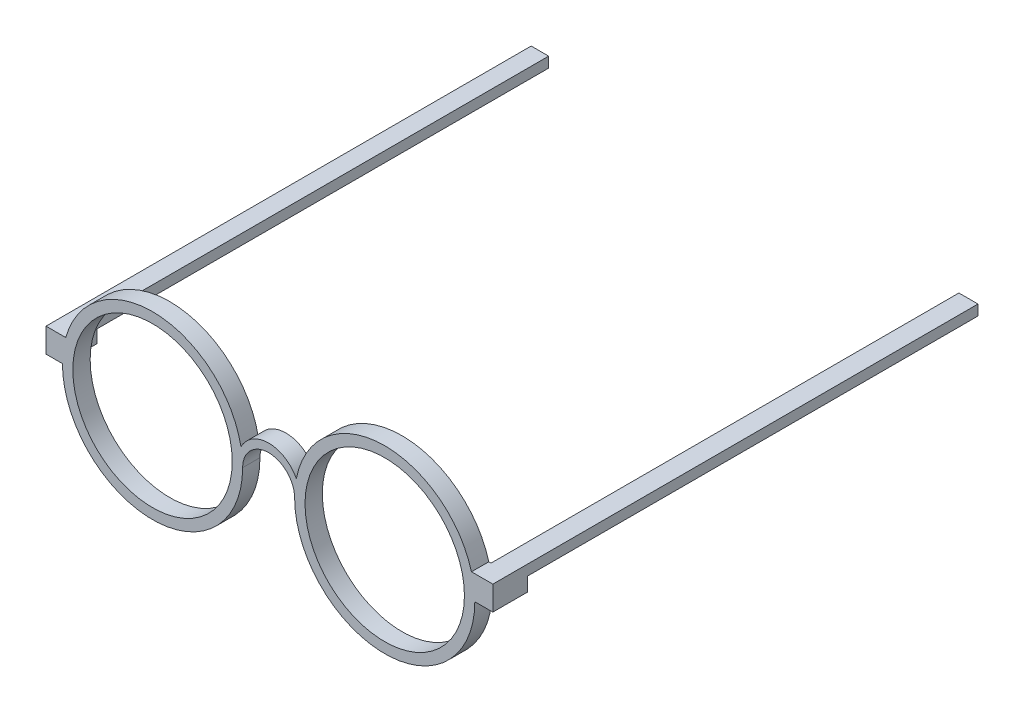
ISO-10303-21;
HEADER;
FILE_DESCRIPTION(('STEP AP214'),'2;1');
FILE_NAME('part.step','',(''),(''),'','','');
FILE_SCHEMA(('AUTOMOTIVE_DESIGN { 1 0 10303 214 1 1 1 1 }'));
ENDSEC;
DATA;
#1=APPLICATION_CONTEXT('core data for automotive mechanical design processes');
#2=APPLICATION_PROTOCOL_DEFINITION('international standard','automotive_design',2000,#1);
#3=PRODUCT_CONTEXT('',#1,'mechanical');
#4=PRODUCT('Part','Part','',(#3));
#5=PRODUCT_RELATED_PRODUCT_CATEGORY('part','',(#4));
#6=PRODUCT_DEFINITION_FORMATION('','',#4);
#7=PRODUCT_DEFINITION_CONTEXT('part definition',#1,'design');
#8=PRODUCT_DEFINITION('design','',#6,#7);
#9=PRODUCT_DEFINITION_SHAPE('','',#8);
#10=(LENGTH_UNIT() NAMED_UNIT(*) SI_UNIT(.MILLI.,.METRE.));
#11=(NAMED_UNIT(*) PLANE_ANGLE_UNIT() SI_UNIT($,.RADIAN.));
#12=(NAMED_UNIT(*) SI_UNIT($,.STERADIAN.) SOLID_ANGLE_UNIT());
#13=UNCERTAINTY_MEASURE_WITH_UNIT(LENGTH_MEASURE(1.E-05),#10,'distance_accuracy_value','');
#14=(GEOMETRIC_REPRESENTATION_CONTEXT(3) GLOBAL_UNCERTAINTY_ASSIGNED_CONTEXT((#13)) GLOBAL_UNIT_ASSIGNED_CONTEXT((#10,
#11,#12)) REPRESENTATION_CONTEXT('',''));
#15=CARTESIAN_POINT('',(0.,0.,0.));
#16=DIRECTION('',(0.,0.,1.));
#17=DIRECTION('',(1.,0.,0.));
#18=AXIS2_PLACEMENT_3D('',#15,#16,#17);
#19=CARTESIAN_POINT('',(-33.5,0.,5.));
#20=DIRECTION('',(0.,0.,-1.));
#21=DIRECTION('',(-1.,0.,0.));
#22=AXIS2_PLACEMENT_3D('',#19,#20,#21);
#23=CYLINDRICAL_SURFACE('',#22,26.);
#24=DIRECTION('',(0.,0.,-1.));
#25=VECTOR('',#24,1.);
#26=CARTESIAN_POINT('',(-58.5399680510978,6.99999999999998,5.));
#27=LINE('',#26,#25);
#28=CARTESIAN_POINT('',(-58.5399680510978,6.99999999999998,5.));
#29=VERTEX_POINT('',#28);
#30=CARTESIAN_POINT('',(-58.5399680510978,6.99999999999998,0.));
#31=VERTEX_POINT('',#30);
#32=EDGE_CURVE('E447',#29,#31,#27,.T.);
#33=ORIENTED_EDGE('',*,*,#32,.F.);
#34=CARTESIAN_POINT('',(-33.5,0.,5.));
#35=DIRECTION('',(0.,0.,1.));
#36=DIRECTION('',(1.,0.,0.));
#37=AXIS2_PLACEMENT_3D('',#34,#35,#36);
#38=CIRCLE('',#37,26.);
#39=CARTESIAN_POINT('',(-7.98076923076923,4.97683242100289,5.));
#40=VERTEX_POINT('',#39);
#41=EDGE_CURVE('E233',#40,#29,#38,.T.);
#42=ORIENTED_EDGE('',*,*,#41,.F.);
#43=DIRECTION('',(0.,0.,-1.));
#44=VECTOR('',#43,1.);
#45=CARTESIAN_POINT('',(-7.98076923076923,4.97683242100289,5.));
#46=LINE('',#45,#44);
#47=CARTESIAN_POINT('',(-7.98076923076923,4.97683242100289,0.));
#48=VERTEX_POINT('',#47);
#49=EDGE_CURVE('E98',#40,#48,#46,.T.);
#50=ORIENTED_EDGE('',*,*,#49,.T.);
#51=CARTESIAN_POINT('',(-33.5,0.,0.));
#52=DIRECTION('',(0.,0.,1.));
#53=DIRECTION('',(1.,0.,0.));
#54=AXIS2_PLACEMENT_3D('',#51,#52,#53);
#55=CIRCLE('',#54,26.);
#56=EDGE_CURVE('E193',#48,#31,#55,.T.);
#57=ORIENTED_EDGE('',*,*,#56,.T.);
#58=EDGE_LOOP('',(#33,#42,#50,#57));
#59=FACE_BOUND('',#58,.T.);
#60=ADVANCED_FACE('F72',(#59),#23,.T.);
#61=CARTESIAN_POINT('',(-59.1904651573303,6.99999999999998,5.));
#62=DIRECTION('',(-1.,0.,0.));
#63=DIRECTION('',(0.,0.,1.));
#64=AXIS2_PLACEMENT_3D('',#61,#62,#63);
#65=PLANE('',#64);
#66=DIRECTION('',(0.,1.,0.));
#67=VECTOR('',#66,1.);
#68=CARTESIAN_POINT('',(-59.1904651573303,6.99999999999998,0.));
#69=LINE('',#68,#67);
#70=CARTESIAN_POINT('',(-59.1904651573303,3.99999999999998,0.));
#71=VERTEX_POINT('',#70);
#72=CARTESIAN_POINT('',(-59.1904651573303,6.99999999999998,0.));
#73=VERTEX_POINT('',#72);
#74=EDGE_CURVE('E89',#71,#73,#69,.T.);
#75=ORIENTED_EDGE('',*,*,#74,.F.);
#76=DIRECTION('',(0.,0.,-1.));
#77=VECTOR('',#76,1.);
#78=CARTESIAN_POINT('',(-59.1904651573303,3.99999999999998,5.));
#79=LINE('',#78,#77);
#80=CARTESIAN_POINT('',(-59.1904651573303,3.99999999999998,-135.));
#81=VERTEX_POINT('',#80);
#82=EDGE_CURVE('E379',#71,#81,#79,.T.);
#83=ORIENTED_EDGE('',*,*,#82,.T.);
#84=DIRECTION('',(0.,-1.,0.));
#85=VECTOR('',#84,1.);
#86=CARTESIAN_POINT('',(-59.1904651573303,6.99999999999998,-135.));
#87=LINE('',#86,#85);
#88=CARTESIAN_POINT('',(-59.1904651573303,6.99999999999998,-135.));
#89=VERTEX_POINT('',#88);
#90=EDGE_CURVE('E401',#89,#81,#87,.T.);
#91=ORIENTED_EDGE('',*,*,#90,.F.);
#92=DIRECTION('',(0.,0.,-1.));
#93=VECTOR('',#92,1.);
#94=CARTESIAN_POINT('',(-59.1904651573303,6.99999999999998,5.));
#95=LINE('',#94,#93);
#96=EDGE_CURVE('E381',#73,#89,#95,.T.);
#97=ORIENTED_EDGE('',*,*,#96,.F.);
#98=EDGE_LOOP('',(#75,#83,#91,#97));
#99=FACE_BOUND('',#98,.T.);
#100=ADVANCED_FACE('F377',(#99),#65,.F.);
#101=CARTESIAN_POINT('',(33.5,0.,5.));
#102=DIRECTION('',(0.,0.,-1.));
#103=DIRECTION('',(-1.,0.,0.));
#104=AXIS2_PLACEMENT_3D('',#101,#102,#103);
#105=CYLINDRICAL_SURFACE('',#104,26.);
#106=DIRECTION('',(0.,0.,-1.));
#107=VECTOR('',#106,1.);
#108=CARTESIAN_POINT('',(58.5399680510978,7.,5.));
#109=LINE('',#108,#107);
#110=CARTESIAN_POINT('',(58.5399680510978,7.,0.));
#111=VERTEX_POINT('',#110);
#112=CARTESIAN_POINT('',(58.5399680510978,7.,5.));
#113=VERTEX_POINT('',#112);
#114=EDGE_CURVE('E394',#111,#113,#109,.F.);
#115=ORIENTED_EDGE('',*,*,#114,.F.);
#116=CARTESIAN_POINT('',(33.5,0.,0.));
#117=DIRECTION('',(0.,0.,1.));
#118=DIRECTION('',(1.,0.,0.));
#119=AXIS2_PLACEMENT_3D('',#116,#117,#118);
#120=CIRCLE('',#119,26.);
#121=CARTESIAN_POINT('',(7.98529835565385,5.00000000000003,0.));
#122=VERTEX_POINT('',#121);
#123=EDGE_CURVE('E205',#111,#122,#120,.T.);
#124=ORIENTED_EDGE('',*,*,#123,.T.);
#125=DIRECTION('',(0.,0.,-1.));
#126=VECTOR('',#125,1.);
#127=CARTESIAN_POINT('',(7.98529835565385,5.00000000000003,5.));
#128=LINE('',#127,#126);
#129=CARTESIAN_POINT('',(7.98529835565385,5.00000000000003,5.));
#130=VERTEX_POINT('',#129);
#131=EDGE_CURVE('E177',#130,#122,#128,.T.);
#132=ORIENTED_EDGE('',*,*,#131,.F.);
#133=CARTESIAN_POINT('',(33.5,0.,5.));
#134=DIRECTION('',(0.,0.,1.));
#135=DIRECTION('',(1.,0.,0.));
#136=AXIS2_PLACEMENT_3D('',#133,#134,#135);
#137=CIRCLE('',#136,26.);
#138=EDGE_CURVE('E184',#113,#130,#137,.T.);
#139=ORIENTED_EDGE('',*,*,#138,.F.);
#140=EDGE_LOOP('',(#115,#124,#132,#139));
#141=FACE_BOUND('',#140,.T.);
#142=ADVANCED_FACE('F462',(#141),#105,.T.);
#143=CARTESIAN_POINT('',(59.1904651573303,7.,5.));
#144=DIRECTION('',(1.,0.,0.));
#145=DIRECTION('',(0.,0.,-1.));
#146=AXIS2_PLACEMENT_3D('',#143,#144,#145);
#147=PLANE('',#146);
#148=DIRECTION('',(0.,-1.,0.));
#149=VECTOR('',#148,1.);
#150=CARTESIAN_POINT('',(59.1904651573303,7.,0.));
#151=LINE('',#150,#149);
#152=CARTESIAN_POINT('',(59.1904651573303,7.,0.));
#153=VERTEX_POINT('',#152);
#154=CARTESIAN_POINT('',(59.1904651573303,4.,0.));
#155=VERTEX_POINT('',#154);
#156=EDGE_CURVE('E317',#153,#155,#151,.T.);
#157=ORIENTED_EDGE('',*,*,#156,.F.);
#158=DIRECTION('',(0.,0.,1.));
#159=VECTOR('',#158,1.);
#160=CARTESIAN_POINT('',(59.1904651573303,7.,5.));
#161=LINE('',#160,#159);
#162=CARTESIAN_POINT('',(59.1904651573302,7.,-135.));
#163=VERTEX_POINT('',#162);
#164=EDGE_CURVE('E405',#163,#153,#161,.T.);
#165=ORIENTED_EDGE('',*,*,#164,.F.);
#166=DIRECTION('',(0.,-1.,0.));
#167=VECTOR('',#166,1.);
#168=CARTESIAN_POINT('',(59.1904651573302,7.,-135.));
#169=LINE('',#168,#167);
#170=CARTESIAN_POINT('',(59.1904651573302,4.,-135.));
#171=VERTEX_POINT('',#170);
#172=EDGE_CURVE('E414',#163,#171,#169,.T.);
#173=ORIENTED_EDGE('',*,*,#172,.T.);
#174=DIRECTION('',(0.,0.,1.));
#175=VECTOR('',#174,1.);
#176=CARTESIAN_POINT('',(59.1904651573303,4.,5.));
#177=LINE('',#176,#175);
#178=EDGE_CURVE('E404',#171,#155,#177,.T.);
#179=ORIENTED_EDGE('',*,*,#178,.T.);
#180=EDGE_LOOP('',(#157,#165,#173,#179));
#181=FACE_BOUND('',#180,.T.);
#182=ADVANCED_FACE('F467',(#181),#147,.F.);
#183=CARTESIAN_POINT('',(0.,0.,0.));
#184=DIRECTION('',(0.,0.,1.));
#185=DIRECTION('',(1.,0.,0.));
#186=AXIS2_PLACEMENT_3D('',#183,#184,#185);
#187=PLANE('',#186);
#188=DIRECTION('',(1.,0.,0.));
#189=VECTOR('',#188,1.);
#190=CARTESIAN_POINT('',(0.,4.,0.));
#191=LINE('',#190,#189);
#192=CARTESIAN_POINT('',(-59.5,3.99999999999998,0.));
#193=VERTEX_POINT('',#192);
#194=EDGE_CURVE('E195',#193,#71,#191,.T.);
#195=ORIENTED_EDGE('',*,*,#194,.T.);
#196=ORIENTED_EDGE('',*,*,#74,.T.);
#197=DIRECTION('',(-1.,0.,0.));
#198=VECTOR('',#197,1.);
#199=CARTESIAN_POINT('',(-56.1904651573303,6.99999999999998,0.));
#200=LINE('',#199,#198);
#201=EDGE_CURVE('E382',#31,#73,#200,.T.);
#202=ORIENTED_EDGE('',*,*,#201,.F.);
#203=ORIENTED_EDGE('',*,*,#56,.F.);
#204=CARTESIAN_POINT('',(0.00809188612239681,0.972483266629338,0.));
#205=DIRECTION('',(0.,0.,1.));
#206=DIRECTION('',(1.,0.,0.));
#207=AXIS2_PLACEMENT_3D('',#204,#205,#206);
#208=CIRCLE('',#207,8.93625839460315);
#209=EDGE_CURVE('E208',#48,#122,#208,.F.);
#210=ORIENTED_EDGE('',*,*,#209,.T.);
#211=ORIENTED_EDGE('',*,*,#123,.F.);
#212=DIRECTION('',(1.,0.,0.));
#213=VECTOR('',#212,1.);
#214=CARTESIAN_POINT('',(56.1904651573303,7.,0.));
#215=LINE('',#214,#213);
#216=EDGE_CURVE('E444',#111,#153,#215,.T.);
#217=ORIENTED_EDGE('',*,*,#216,.T.);
#218=ORIENTED_EDGE('',*,*,#156,.T.);
#219=DIRECTION('',(-1.,0.,0.));
#220=VECTOR('',#219,1.);
#221=CARTESIAN_POINT('',(0.,3.99999999999999,0.));
#222=LINE('',#221,#220);
#223=CARTESIAN_POINT('',(59.5,4.,0.));
#224=VERTEX_POINT('',#223);
#225=EDGE_CURVE('E204',#224,#155,#222,.T.);
#226=ORIENTED_EDGE('',*,*,#225,.F.);
#227=DIRECTION('',(0.,1.,0.));
#228=VECTOR('',#227,1.);
#229=CARTESIAN_POINT('',(59.5,4.,0.));
#230=LINE('',#229,#228);
#231=CARTESIAN_POINT('',(59.5,0.,0.));
#232=VERTEX_POINT('',#231);
#233=EDGE_CURVE('E214',#232,#224,#230,.T.);
#234=ORIENTED_EDGE('',*,*,#233,.F.);
#235=CARTESIAN_POINT('',(7.49999999999999,0.,0.));
#236=VERTEX_POINT('',#235);
#237=EDGE_CURVE('E201',#236,#232,#120,.T.);
#238=ORIENTED_EDGE('',*,*,#237,.F.);
#239=CARTESIAN_POINT('',(0.,0.,0.));
#240=DIRECTION('',(0.,0.,1.));
#241=DIRECTION('',(1.,0.,0.));
#242=AXIS2_PLACEMENT_3D('',#239,#240,#241);
#243=CIRCLE('',#242,7.49999999999999);
#244=CARTESIAN_POINT('',(-7.5,0.,0.));
#245=VERTEX_POINT('',#244);
#246=EDGE_CURVE('E199',#245,#236,#243,.F.);
#247=ORIENTED_EDGE('',*,*,#246,.F.);
#248=CARTESIAN_POINT('',(-59.5,0.,0.));
#249=VERTEX_POINT('',#248);
#250=EDGE_CURVE('E197',#249,#245,#55,.T.);
#251=ORIENTED_EDGE('',*,*,#250,.F.);
#252=DIRECTION('',(0.,-1.,0.));
#253=VECTOR('',#252,1.);
#254=CARTESIAN_POINT('',(-59.5,4.,0.));
#255=LINE('',#254,#253);
#256=EDGE_CURVE('E272',#193,#249,#255,.T.);
#257=ORIENTED_EDGE('',*,*,#256,.F.);
#258=EDGE_LOOP('',(#195,#196,#202,#203,#210,#211,#217,#218,#226,#234,#238,#247,#251,#257));
#259=FACE_BOUND('',#258,.T.);
#260=CARTESIAN_POINT('',(33.5,0.,0.));
#261=DIRECTION('',(0.,0.,1.));
#262=DIRECTION('',(1.,0.,0.));
#263=AXIS2_PLACEMENT_3D('',#260,#261,#262);
#264=CIRCLE('',#263,23.);
#265=CARTESIAN_POINT('',(56.5,0.,0.));
#266=VERTEX_POINT('',#265);
#267=EDGE_CURVE('E236',#266,#266,#264,.T.);
#268=ORIENTED_EDGE('',*,*,#267,.T.);
#269=EDGE_LOOP('',(#268));
#270=FACE_BOUND('',#269,.T.);
#271=CARTESIAN_POINT('',(-33.5,0.,0.));
#272=DIRECTION('',(0.,0.,1.));
#273=DIRECTION('',(1.,0.,0.));
#274=AXIS2_PLACEMENT_3D('',#271,#272,#273);
#275=CIRCLE('',#274,23.);
#276=CARTESIAN_POINT('',(-10.5,0.,0.));
#277=VERTEX_POINT('',#276);
#278=EDGE_CURVE('E228',#277,#277,#275,.T.);
#279=ORIENTED_EDGE('',*,*,#278,.T.);
#280=EDGE_LOOP('',(#279));
#281=FACE_BOUND('',#280,.T.);
#282=ADVANCED_FACE('F269',(#259,#270,#281),#187,.F.);
#283=CARTESIAN_POINT('',(0.,0.,5.));
#284=DIRECTION('',(0.,0.,1.));
#285=DIRECTION('',(1.,0.,0.));
#286=AXIS2_PLACEMENT_3D('',#283,#284,#285);
#287=PLANE('',#286);
#288=ORIENTED_EDGE('',*,*,#41,.T.);
#289=DIRECTION('',(1.,0.,0.));
#290=VECTOR('',#289,1.);
#291=CARTESIAN_POINT('',(-64.2407936733775,6.99999999999998,5.));
#292=LINE('',#291,#290);
#293=CARTESIAN_POINT('',(-64.2407936733775,6.99999999999998,5.));
#294=VERTEX_POINT('',#293);
#295=EDGE_CURVE('E437',#294,#29,#292,.T.);
#296=ORIENTED_EDGE('',*,*,#295,.F.);
#297=DIRECTION('',(0.,1.,0.));
#298=VECTOR('',#297,1.);
#299=CARTESIAN_POINT('',(-64.2407936733775,0.,5.));
#300=LINE('',#299,#298);
#301=CARTESIAN_POINT('',(-64.2407936733775,0.,5.));
#302=VERTEX_POINT('',#301);
#303=EDGE_CURVE('E235',#302,#294,#300,.T.);
#304=ORIENTED_EDGE('',*,*,#303,.F.);
#305=DIRECTION('',(-1.,0.,0.));
#306=VECTOR('',#305,1.);
#307=CARTESIAN_POINT('',(0.,0.,5.));
#308=LINE('',#307,#306);
#309=CARTESIAN_POINT('',(-59.5,0.,5.));
#310=VERTEX_POINT('',#309);
#311=EDGE_CURVE('E239',#310,#302,#308,.T.);
#312=ORIENTED_EDGE('',*,*,#311,.F.);
#313=CARTESIAN_POINT('',(-7.5,0.,5.));
#314=VERTEX_POINT('',#313);
#315=EDGE_CURVE('E237',#310,#314,#38,.T.);
#316=ORIENTED_EDGE('',*,*,#315,.T.);
#317=CARTESIAN_POINT('',(0.,0.,5.));
#318=DIRECTION('',(0.,0.,1.));
#319=DIRECTION('',(1.,0.,0.));
#320=AXIS2_PLACEMENT_3D('',#317,#318,#319);
#321=CIRCLE('',#320,7.49999999999999);
#322=CARTESIAN_POINT('',(7.49999999999999,0.,5.));
#323=VERTEX_POINT('',#322);
#324=EDGE_CURVE('E242',#314,#323,#321,.F.);
#325=ORIENTED_EDGE('',*,*,#324,.T.);
#326=CARTESIAN_POINT('',(59.5,0.,5.));
#327=VERTEX_POINT('',#326);
#328=EDGE_CURVE('E160',#323,#327,#137,.T.);
#329=ORIENTED_EDGE('',*,*,#328,.T.);
#330=DIRECTION('',(1.,0.,0.));
#331=VECTOR('',#330,1.);
#332=CARTESIAN_POINT('',(0.,0.,5.));
#333=LINE('',#332,#331);
#334=CARTESIAN_POINT('',(64.7005027247971,0.,5.));
#335=VERTEX_POINT('',#334);
#336=EDGE_CURVE('E149',#327,#335,#333,.T.);
#337=ORIENTED_EDGE('',*,*,#336,.T.);
#338=DIRECTION('',(0.,1.,0.));
#339=VECTOR('',#338,1.);
#340=CARTESIAN_POINT('',(64.7005027247971,0.,5.));
#341=LINE('',#340,#339);
#342=CARTESIAN_POINT('',(64.7005027247971,7.,5.));
#343=VERTEX_POINT('',#342);
#344=EDGE_CURVE('E157',#335,#343,#341,.T.);
#345=ORIENTED_EDGE('',*,*,#344,.T.);
#346=DIRECTION('',(1.,0.,0.));
#347=VECTOR('',#346,1.);
#348=CARTESIAN_POINT('',(59.1904651573303,7.,5.));
#349=LINE('',#348,#347);
#350=EDGE_CURVE('E408',#113,#343,#349,.T.);
#351=ORIENTED_EDGE('',*,*,#350,.F.);
#352=ORIENTED_EDGE('',*,*,#138,.T.);
#353=CARTESIAN_POINT('',(0.00809188612239681,0.972483266629338,5.));
#354=DIRECTION('',(0.,0.,1.));
#355=DIRECTION('',(1.,0.,0.));
#356=AXIS2_PLACEMENT_3D('',#353,#354,#355);
#357=CIRCLE('',#356,8.93625839460315);
#358=EDGE_CURVE('E186',#40,#130,#357,.F.);
#359=ORIENTED_EDGE('',*,*,#358,.F.);
#360=EDGE_LOOP('',(#288,#296,#304,#312,#316,#325,#329,#337,#345,#351,#352,#359));
#361=FACE_BOUND('',#360,.T.);
#362=CARTESIAN_POINT('',(33.5,0.,5.));
#363=DIRECTION('',(0.,0.,1.));
#364=DIRECTION('',(1.,0.,0.));
#365=AXIS2_PLACEMENT_3D('',#362,#363,#364);
#366=CIRCLE('',#365,23.);
#367=CARTESIAN_POINT('',(56.5,0.,5.));
#368=VERTEX_POINT('',#367);
#369=EDGE_CURVE('E190',#368,#368,#366,.T.);
#370=ORIENTED_EDGE('',*,*,#369,.F.);
#371=EDGE_LOOP('',(#370));
#372=FACE_BOUND('',#371,.T.);
#373=CARTESIAN_POINT('',(-33.5,0.,5.));
#374=DIRECTION('',(0.,0.,1.));
#375=DIRECTION('',(1.,0.,0.));
#376=AXIS2_PLACEMENT_3D('',#373,#374,#375);
#377=CIRCLE('',#376,23.);
#378=CARTESIAN_POINT('',(-10.5,0.,5.));
#379=VERTEX_POINT('',#378);
#380=EDGE_CURVE('E196',#379,#379,#377,.T.);
#381=ORIENTED_EDGE('',*,*,#380,.F.);
#382=EDGE_LOOP('',(#381));
#383=FACE_BOUND('',#382,.T.);
#384=ADVANCED_FACE('F152',(#361,#372,#383),#287,.T.);
#385=CARTESIAN_POINT('',(-64.2407936733775,0.,5.));
#386=DIRECTION('',(-1.,0.,0.));
#387=DIRECTION('',(0.,0.,1.));
#388=AXIS2_PLACEMENT_3D('',#385,#386,#387);
#389=PLANE('',#388);
#390=ORIENTED_EDGE('',*,*,#303,.T.);
#391=DIRECTION('',(0.,0.,1.));
#392=VECTOR('',#391,1.);
#393=CARTESIAN_POINT('',(-64.2407936733775,6.99999999999998,5.));
#394=LINE('',#393,#392);
#395=CARTESIAN_POINT('',(-64.2407936733776,6.99999999999998,-135.));
#396=VERTEX_POINT('',#395);
#397=EDGE_CURVE('E391',#396,#294,#394,.T.);
#398=ORIENTED_EDGE('',*,*,#397,.F.);
#399=DIRECTION('',(0.,-1.,0.));
#400=VECTOR('',#399,1.);
#401=CARTESIAN_POINT('',(-64.2407936733776,6.99999999999998,-135.));
#402=LINE('',#401,#400);
#403=CARTESIAN_POINT('',(-64.2407936733776,3.99999999999998,-135.));
#404=VERTEX_POINT('',#403);
#405=EDGE_CURVE('E398',#396,#404,#402,.T.);
#406=ORIENTED_EDGE('',*,*,#405,.T.);
#407=DIRECTION('',(0.,0.,1.));
#408=VECTOR('',#407,1.);
#409=CARTESIAN_POINT('',(-64.2407936733775,3.99999999999998,5.));
#410=LINE('',#409,#408);
#411=CARTESIAN_POINT('',(-64.2407936733775,3.99999999999998,-5.));
#412=VERTEX_POINT('',#411);
#413=EDGE_CURVE('E389',#404,#412,#410,.T.);
#414=ORIENTED_EDGE('',*,*,#413,.T.);
#415=DIRECTION('',(0.,1.,0.));
#416=VECTOR('',#415,1.);
#417=CARTESIAN_POINT('',(-64.2407936733775,4.,-5.));
#418=LINE('',#417,#416);
#419=CARTESIAN_POINT('',(-64.2407936733775,0.,-5.));
#420=VERTEX_POINT('',#419);
#421=EDGE_CURVE('E282',#420,#412,#418,.T.);
#422=ORIENTED_EDGE('',*,*,#421,.F.);
#423=DIRECTION('',(0.,0.,-1.));
#424=VECTOR('',#423,1.);
#425=CARTESIAN_POINT('',(-64.2407936733775,0.,5.));
#426=LINE('',#425,#424);
#427=EDGE_CURVE('E12',#302,#420,#426,.T.);
#428=ORIENTED_EDGE('',*,*,#427,.F.);
#429=EDGE_LOOP('',(#390,#398,#406,#414,#422,#428));
#430=FACE_BOUND('',#429,.T.);
#431=ADVANCED_FACE('F74',(#430),#389,.T.);
#432=CARTESIAN_POINT('',(0.,0.,5.));
#433=DIRECTION('',(0.,-1.,0.));
#434=DIRECTION('',(0.,0.,-1.));
#435=AXIS2_PLACEMENT_3D('',#432,#433,#434);
#436=PLANE('',#435);
#437=ORIENTED_EDGE('',*,*,#427,.T.);
#438=DIRECTION('',(-1.,0.,0.));
#439=VECTOR('',#438,1.);
#440=CARTESIAN_POINT('',(-64.2407936733775,0.,-5.));
#441=LINE('',#440,#439);
#442=CARTESIAN_POINT('',(-59.5,0.,-5.));
#443=VERTEX_POINT('',#442);
#444=EDGE_CURVE('E287',#443,#420,#441,.T.);
#445=ORIENTED_EDGE('',*,*,#444,.F.);
#446=DIRECTION('',(0.,0.,1.));
#447=VECTOR('',#446,1.);
#448=CARTESIAN_POINT('',(-59.5,0.,-5.));
#449=LINE('',#448,#447);
#450=EDGE_CURVE('E279',#443,#249,#449,.T.);
#451=ORIENTED_EDGE('',*,*,#450,.T.);
#452=DIRECTION('',(0.,0.,-1.));
#453=VECTOR('',#452,1.);
#454=CARTESIAN_POINT('',(-59.5,0.,5.));
#455=LINE('',#454,#453);
#456=EDGE_CURVE('E81',#310,#249,#455,.T.);
#457=ORIENTED_EDGE('',*,*,#456,.F.);
#458=ORIENTED_EDGE('',*,*,#311,.T.);
#459=EDGE_LOOP('',(#437,#445,#451,#457,#458));
#460=FACE_BOUND('',#459,.T.);
#461=ADVANCED_FACE('F285',(#460),#436,.T.);
#462=ORIENTED_EDGE('',*,*,#250,.T.);
#463=DIRECTION('',(0.,0.,-1.));
#464=VECTOR('',#463,1.);
#465=CARTESIAN_POINT('',(-7.5,0.,5.));
#466=LINE('',#465,#464);
#467=EDGE_CURVE('E250',#314,#245,#466,.T.);
#468=ORIENTED_EDGE('',*,*,#467,.F.);
#469=ORIENTED_EDGE('',*,*,#315,.F.);
#470=ORIENTED_EDGE('',*,*,#456,.T.);
#471=EDGE_LOOP('',(#462,#468,#469,#470));
#472=FACE_BOUND('',#471,.T.);
#473=ADVANCED_FACE('F251',(#472),#23,.T.);
#474=CARTESIAN_POINT('',(0.,0.,5.));
#475=DIRECTION('',(0.,0.,-1.));
#476=DIRECTION('',(-1.,0.,0.));
#477=AXIS2_PLACEMENT_3D('',#474,#475,#476);
#478=CYLINDRICAL_SURFACE('',#477,7.49999999999999);
#479=ORIENTED_EDGE('',*,*,#246,.T.);
#480=DIRECTION('',(0.,0.,-1.));
#481=VECTOR('',#480,1.);
#482=CARTESIAN_POINT('',(7.49999999999999,0.,5.));
#483=LINE('',#482,#481);
#484=EDGE_CURVE('E255',#323,#236,#483,.T.);
#485=ORIENTED_EDGE('',*,*,#484,.F.);
#486=ORIENTED_EDGE('',*,*,#324,.F.);
#487=ORIENTED_EDGE('',*,*,#467,.T.);
#488=EDGE_LOOP('',(#479,#485,#486,#487));
#489=FACE_BOUND('',#488,.T.);
#490=ADVANCED_FACE('F257',(#489),#478,.F.);
#491=ORIENTED_EDGE('',*,*,#237,.T.);
#492=DIRECTION('',(0.,0.,-1.));
#493=VECTOR('',#492,1.);
#494=CARTESIAN_POINT('',(59.5,0.,5.));
#495=LINE('',#494,#493);
#496=EDGE_CURVE('E176',#327,#232,#495,.T.);
#497=ORIENTED_EDGE('',*,*,#496,.F.);
#498=ORIENTED_EDGE('',*,*,#328,.F.);
#499=ORIENTED_EDGE('',*,*,#484,.T.);
#500=EDGE_LOOP('',(#491,#497,#498,#499));
#501=FACE_BOUND('',#500,.T.);
#502=ADVANCED_FACE('F262',(#501),#105,.T.);
#503=CARTESIAN_POINT('',(0.,0.,5.));
#504=DIRECTION('',(0.,1.,0.));
#505=DIRECTION('',(0.,0.,1.));
#506=AXIS2_PLACEMENT_3D('',#503,#504,#505);
#507=PLANE('',#506);
#508=ORIENTED_EDGE('',*,*,#496,.T.);
#509=DIRECTION('',(0.,0.,1.));
#510=VECTOR('',#509,1.);
#511=CARTESIAN_POINT('',(59.5,0.,-5.));
#512=LINE('',#511,#510);
#513=CARTESIAN_POINT('',(59.5,0.,-5.));
#514=VERTEX_POINT('',#513);
#515=EDGE_CURVE('E225',#514,#232,#512,.T.);
#516=ORIENTED_EDGE('',*,*,#515,.F.);
#517=DIRECTION('',(-1.,0.,0.));
#518=VECTOR('',#517,1.);
#519=CARTESIAN_POINT('',(64.7005027247971,0.,-5.));
#520=LINE('',#519,#518);
#521=CARTESIAN_POINT('',(64.7005027247971,0.,-5.));
#522=VERTEX_POINT('',#521);
#523=EDGE_CURVE('E172',#522,#514,#520,.T.);
#524=ORIENTED_EDGE('',*,*,#523,.F.);
#525=DIRECTION('',(0.,0.,-1.));
#526=VECTOR('',#525,1.);
#527=CARTESIAN_POINT('',(64.7005027247971,0.,5.));
#528=LINE('',#527,#526);
#529=EDGE_CURVE('E167',#335,#522,#528,.T.);
#530=ORIENTED_EDGE('',*,*,#529,.F.);
#531=ORIENTED_EDGE('',*,*,#336,.F.);
#532=EDGE_LOOP('',(#508,#516,#524,#530,#531));
#533=FACE_BOUND('',#532,.T.);
#534=ADVANCED_FACE('F168',(#533),#507,.F.);
#535=CARTESIAN_POINT('',(64.7005027247971,0.,5.));
#536=DIRECTION('',(-1.,0.,0.));
#537=DIRECTION('',(0.,0.,1.));
#538=AXIS2_PLACEMENT_3D('',#535,#536,#537);
#539=PLANE('',#538);
#540=ORIENTED_EDGE('',*,*,#529,.T.);
#541=DIRECTION('',(0.,-1.,0.));
#542=VECTOR('',#541,1.);
#543=CARTESIAN_POINT('',(64.7005027247971,4.,-5.));
#544=LINE('',#543,#542);
#545=CARTESIAN_POINT('',(64.7005027247971,4.,-5.));
#546=VERTEX_POINT('',#545);
#547=EDGE_CURVE('E217',#546,#522,#544,.T.);
#548=ORIENTED_EDGE('',*,*,#547,.F.);
#549=DIRECTION('',(0.,0.,-1.));
#550=VECTOR('',#549,1.);
#551=CARTESIAN_POINT('',(64.7005027247971,4.,5.));
#552=LINE('',#551,#550);
#553=CARTESIAN_POINT('',(64.7005027247971,4.,-135.));
#554=VERTEX_POINT('',#553);
#555=EDGE_CURVE('E416',#546,#554,#552,.T.);
#556=ORIENTED_EDGE('',*,*,#555,.T.);
#557=DIRECTION('',(0.,-1.,0.));
#558=VECTOR('',#557,1.);
#559=CARTESIAN_POINT('',(64.7005027247971,7.,-135.));
#560=LINE('',#559,#558);
#561=CARTESIAN_POINT('',(64.7005027247971,7.,-135.));
#562=VERTEX_POINT('',#561);
#563=EDGE_CURVE('E283',#562,#554,#560,.T.);
#564=ORIENTED_EDGE('',*,*,#563,.F.);
#565=DIRECTION('',(0.,0.,-1.));
#566=VECTOR('',#565,1.);
#567=CARTESIAN_POINT('',(64.7005027247971,7.,5.));
#568=LINE('',#567,#566);
#569=EDGE_CURVE('E183',#343,#562,#568,.T.);
#570=ORIENTED_EDGE('',*,*,#569,.F.);
#571=ORIENTED_EDGE('',*,*,#344,.F.);
#572=EDGE_LOOP('',(#540,#548,#556,#564,#570,#571));
#573=FACE_BOUND('',#572,.T.);
#574=ADVANCED_FACE('F180',(#573),#539,.F.);
#575=CARTESIAN_POINT('',(0.00809188612239681,0.972483266629338,5.));
#576=DIRECTION('',(0.,0.,-1.));
#577=DIRECTION('',(-1.,0.,0.));
#578=AXIS2_PLACEMENT_3D('',#575,#576,#577);
#579=CYLINDRICAL_SURFACE('',#578,8.93625839460315);
#580=ORIENTED_EDGE('',*,*,#209,.F.);
#581=ORIENTED_EDGE('',*,*,#49,.F.);
#582=ORIENTED_EDGE('',*,*,#358,.T.);
#583=ORIENTED_EDGE('',*,*,#131,.T.);
#584=EDGE_LOOP('',(#580,#581,#582,#583));
#585=FACE_BOUND('',#584,.T.);
#586=ADVANCED_FACE('F457',(#585),#579,.T.);
#587=CARTESIAN_POINT('',(33.5,0.,5.));
#588=DIRECTION('',(0.,0.,-1.));
#589=DIRECTION('',(-1.,0.,0.));
#590=AXIS2_PLACEMENT_3D('',#587,#588,#589);
#591=CYLINDRICAL_SURFACE('',#590,23.);
#592=ORIENTED_EDGE('',*,*,#369,.T.);
#593=EDGE_LOOP('',(#592));
#594=FACE_BOUND('',#593,.T.);
#595=ORIENTED_EDGE('',*,*,#267,.F.);
#596=EDGE_LOOP('',(#595));
#597=FACE_BOUND('',#596,.T.);
#598=ADVANCED_FACE('F514',(#594,#597),#591,.F.);
#599=CARTESIAN_POINT('',(-33.5,0.,5.));
#600=DIRECTION('',(0.,0.,-1.));
#601=DIRECTION('',(-1.,0.,0.));
#602=AXIS2_PLACEMENT_3D('',#599,#600,#601);
#603=CYLINDRICAL_SURFACE('',#602,23.);
#604=ORIENTED_EDGE('',*,*,#380,.T.);
#605=EDGE_LOOP('',(#604));
#606=FACE_BOUND('',#605,.T.);
#607=ORIENTED_EDGE('',*,*,#278,.F.);
#608=EDGE_LOOP('',(#607));
#609=FACE_BOUND('',#608,.T.);
#610=ADVANCED_FACE('F481',(#606,#609),#603,.F.);
#611=CARTESIAN_POINT('',(59.5,4.,-5.));
#612=DIRECTION('',(1.,0.,0.));
#613=DIRECTION('',(0.,0.,-1.));
#614=AXIS2_PLACEMENT_3D('',#611,#612,#613);
#615=PLANE('',#614);
#616=ORIENTED_EDGE('',*,*,#233,.T.);
#617=DIRECTION('',(0.,0.,1.));
#618=VECTOR('',#617,1.);
#619=CARTESIAN_POINT('',(59.5,4.,-5.));
#620=LINE('',#619,#618);
#621=CARTESIAN_POINT('',(59.5,4.,-5.));
#622=VERTEX_POINT('',#621);
#623=EDGE_CURVE('E219',#622,#224,#620,.T.);
#624=ORIENTED_EDGE('',*,*,#623,.F.);
#625=DIRECTION('',(0.,1.,0.));
#626=VECTOR('',#625,1.);
#627=CARTESIAN_POINT('',(59.5,4.,-5.));
#628=LINE('',#627,#626);
#629=EDGE_CURVE('E294',#514,#622,#628,.T.);
#630=ORIENTED_EDGE('',*,*,#629,.F.);
#631=ORIENTED_EDGE('',*,*,#515,.T.);
#632=EDGE_LOOP('',(#616,#624,#630,#631));
#633=FACE_BOUND('',#632,.T.);
#634=ADVANCED_FACE('F318',(#633),#615,.F.);
#635=CARTESIAN_POINT('',(0.,0.,-5.));
#636=DIRECTION('',(0.,0.,-1.));
#637=DIRECTION('',(-1.,0.,0.));
#638=AXIS2_PLACEMENT_3D('',#635,#636,#637);
#639=PLANE('',#638);
#640=ORIENTED_EDGE('',*,*,#547,.T.);
#641=ORIENTED_EDGE('',*,*,#523,.T.);
#642=ORIENTED_EDGE('',*,*,#629,.T.);
#643=DIRECTION('',(1.,0.,0.));
#644=VECTOR('',#643,1.);
#645=CARTESIAN_POINT('',(64.7005027247971,4.,-5.));
#646=LINE('',#645,#644);
#647=EDGE_CURVE('E223',#622,#546,#646,.T.);
#648=ORIENTED_EDGE('',*,*,#647,.T.);
#649=EDGE_LOOP('',(#640,#641,#642,#648));
#650=FACE_BOUND('',#649,.T.);
#651=ADVANCED_FACE('F473',(#650),#639,.T.);
#652=CARTESIAN_POINT('',(-59.5,4.,-5.));
#653=DIRECTION('',(-1.,0.,0.));
#654=DIRECTION('',(0.,0.,1.));
#655=AXIS2_PLACEMENT_3D('',#652,#653,#654);
#656=PLANE('',#655);
#657=ORIENTED_EDGE('',*,*,#256,.T.);
#658=ORIENTED_EDGE('',*,*,#450,.F.);
#659=DIRECTION('',(0.,-1.,0.));
#660=VECTOR('',#659,1.);
#661=CARTESIAN_POINT('',(-59.5,4.,-5.));
#662=LINE('',#661,#660);
#663=CARTESIAN_POINT('',(-59.5,4.,-5.));
#664=VERTEX_POINT('',#663);
#665=EDGE_CURVE('E290',#664,#443,#662,.T.);
#666=ORIENTED_EDGE('',*,*,#665,.F.);
#667=DIRECTION('',(0.,0.,1.));
#668=VECTOR('',#667,1.);
#669=CARTESIAN_POINT('',(-59.5,4.,-5.));
#670=LINE('',#669,#668);
#671=EDGE_CURVE('E218',#664,#193,#670,.T.);
#672=ORIENTED_EDGE('',*,*,#671,.T.);
#673=EDGE_LOOP('',(#657,#658,#666,#672));
#674=FACE_BOUND('',#673,.T.);
#675=ADVANCED_FACE('F276',(#674),#656,.F.);
#676=CARTESIAN_POINT('',(0.,0.,-5.));
#677=DIRECTION('',(0.,0.,1.));
#678=DIRECTION('',(1.,0.,0.));
#679=AXIS2_PLACEMENT_3D('',#676,#677,#678);
#680=PLANE('',#679);
#681=ORIENTED_EDGE('',*,*,#421,.T.);
#682=DIRECTION('',(1.,0.,0.));
#683=VECTOR('',#682,1.);
#684=CARTESIAN_POINT('',(-64.2407936733775,4.,-5.));
#685=LINE('',#684,#683);
#686=EDGE_CURVE('E425',#412,#664,#685,.T.);
#687=ORIENTED_EDGE('',*,*,#686,.T.);
#688=ORIENTED_EDGE('',*,*,#665,.T.);
#689=ORIENTED_EDGE('',*,*,#444,.T.);
#690=EDGE_LOOP('',(#681,#687,#688,#689));
#691=FACE_BOUND('',#690,.T.);
#692=ADVANCED_FACE('F429',(#691),#680,.F.);
#693=CARTESIAN_POINT('',(0.,3.99999999999999,0.));
#694=DIRECTION('',(0.,-1.,0.));
#695=DIRECTION('',(1.,0.,0.));
#696=AXIS2_PLACEMENT_3D('',#693,#694,#695);
#697=PLANE('',#696);
#698=ORIENTED_EDGE('',*,*,#225,.T.);
#699=ORIENTED_EDGE('',*,*,#178,.F.);
#700=DIRECTION('',(-1.,0.,0.));
#701=VECTOR('',#700,1.);
#702=CARTESIAN_POINT('',(59.1904651573302,4.,-135.));
#703=LINE('',#702,#701);
#704=EDGE_CURVE('E409',#554,#171,#703,.T.);
#705=ORIENTED_EDGE('',*,*,#704,.F.);
#706=ORIENTED_EDGE('',*,*,#555,.F.);
#707=ORIENTED_EDGE('',*,*,#647,.F.);
#708=ORIENTED_EDGE('',*,*,#623,.T.);
#709=EDGE_LOOP('',(#698,#699,#705,#706,#707,#708));
#710=FACE_BOUND('',#709,.T.);
#711=ADVANCED_FACE('F306',(#710),#697,.T.);
#712=CARTESIAN_POINT('',(59.1904651573302,7.,-135.));
#713=DIRECTION('',(0.,0.,1.));
#714=DIRECTION('',(1.,0.,0.));
#715=AXIS2_PLACEMENT_3D('',#712,#713,#714);
#716=PLANE('',#715);
#717=ORIENTED_EDGE('',*,*,#704,.T.);
#718=ORIENTED_EDGE('',*,*,#172,.F.);
#719=DIRECTION('',(-1.,0.,0.));
#720=VECTOR('',#719,1.);
#721=CARTESIAN_POINT('',(59.1904651573302,7.,-135.));
#722=LINE('',#721,#720);
#723=EDGE_CURVE('E412',#562,#163,#722,.T.);
#724=ORIENTED_EDGE('',*,*,#723,.F.);
#725=ORIENTED_EDGE('',*,*,#563,.T.);
#726=EDGE_LOOP('',(#717,#718,#724,#725));
#727=FACE_BOUND('',#726,.T.);
#728=ADVANCED_FACE('F471',(#727),#716,.F.);
#729=CARTESIAN_POINT('',(0.,6.99999999999999,0.));
#730=DIRECTION('',(0.,-1.,0.));
#731=DIRECTION('',(1.,0.,0.));
#732=AXIS2_PLACEMENT_3D('',#729,#730,#731);
#733=PLANE('',#732);
#734=ORIENTED_EDGE('',*,*,#164,.T.);
#735=ORIENTED_EDGE('',*,*,#216,.F.);
#736=ORIENTED_EDGE('',*,*,#114,.T.);
#737=ORIENTED_EDGE('',*,*,#350,.T.);
#738=ORIENTED_EDGE('',*,*,#569,.T.);
#739=ORIENTED_EDGE('',*,*,#723,.T.);
#740=EDGE_LOOP('',(#734,#735,#736,#737,#738,#739));
#741=FACE_BOUND('',#740,.T.);
#742=ADVANCED_FACE('F464',(#741),#733,.F.);
#743=CARTESIAN_POINT('',(0.,3.99999999999999,0.));
#744=DIRECTION('',(0.,-1.,0.));
#745=DIRECTION('',(1.,0.,0.));
#746=AXIS2_PLACEMENT_3D('',#743,#744,#745);
#747=PLANE('',#746);
#748=ORIENTED_EDGE('',*,*,#194,.F.);
#749=ORIENTED_EDGE('',*,*,#671,.F.);
#750=ORIENTED_EDGE('',*,*,#686,.F.);
#751=ORIENTED_EDGE('',*,*,#413,.F.);
#752=DIRECTION('',(-1.,0.,0.));
#753=VECTOR('',#752,1.);
#754=CARTESIAN_POINT('',(-64.2407936733776,3.99999999999998,-135.));
#755=LINE('',#754,#753);
#756=EDGE_CURVE('E388',#81,#404,#755,.T.);
#757=ORIENTED_EDGE('',*,*,#756,.F.);
#758=ORIENTED_EDGE('',*,*,#82,.F.);
#759=EDGE_LOOP('',(#748,#749,#750,#751,#757,#758));
#760=FACE_BOUND('',#759,.T.);
#761=ADVANCED_FACE('F386',(#760),#747,.T.);
#762=CARTESIAN_POINT('',(-64.2407936733776,6.99999999999998,-135.));
#763=DIRECTION('',(0.,0.,1.));
#764=DIRECTION('',(1.,0.,0.));
#765=AXIS2_PLACEMENT_3D('',#762,#763,#764);
#766=PLANE('',#765);
#767=ORIENTED_EDGE('',*,*,#756,.T.);
#768=ORIENTED_EDGE('',*,*,#405,.F.);
#769=DIRECTION('',(-1.,0.,0.));
#770=VECTOR('',#769,1.);
#771=CARTESIAN_POINT('',(-64.2407936733776,6.99999999999998,-135.));
#772=LINE('',#771,#770);
#773=EDGE_CURVE('E402',#89,#396,#772,.T.);
#774=ORIENTED_EDGE('',*,*,#773,.F.);
#775=ORIENTED_EDGE('',*,*,#90,.T.);
#776=EDGE_LOOP('',(#767,#768,#774,#775));
#777=FACE_BOUND('',#776,.T.);
#778=ADVANCED_FACE('F435',(#777),#766,.F.);
#779=CARTESIAN_POINT('',(0.,6.99999999999999,0.));
#780=DIRECTION('',(0.,-1.,0.));
#781=DIRECTION('',(1.,0.,0.));
#782=AXIS2_PLACEMENT_3D('',#779,#780,#781);
#783=PLANE('',#782);
#784=ORIENTED_EDGE('',*,*,#397,.T.);
#785=ORIENTED_EDGE('',*,*,#295,.T.);
#786=ORIENTED_EDGE('',*,*,#32,.T.);
#787=ORIENTED_EDGE('',*,*,#201,.T.);
#788=ORIENTED_EDGE('',*,*,#96,.T.);
#789=ORIENTED_EDGE('',*,*,#773,.T.);
#790=EDGE_LOOP('',(#784,#785,#786,#787,#788,#789));
#791=FACE_BOUND('',#790,.T.);
#792=ADVANCED_FACE('F449',(#791),#783,.F.);
#793=CLOSED_SHELL('',(#60,#100,#142,#182,#282,#384,#431,#461,#473,#490,#502,#534,#574,#586,#598,
#610,#634,#651,#675,#692,#711,#728,#742,#761,#778,#792));
#794=MANIFOLD_SOLID_BREP('B2',#793);
#795=ADVANCED_BREP_SHAPE_REPRESENTATION('',(#18,#794),#14);
#796=SHAPE_DEFINITION_REPRESENTATION(#9,#795);
ENDSEC;
END-ISO-10303-21;
